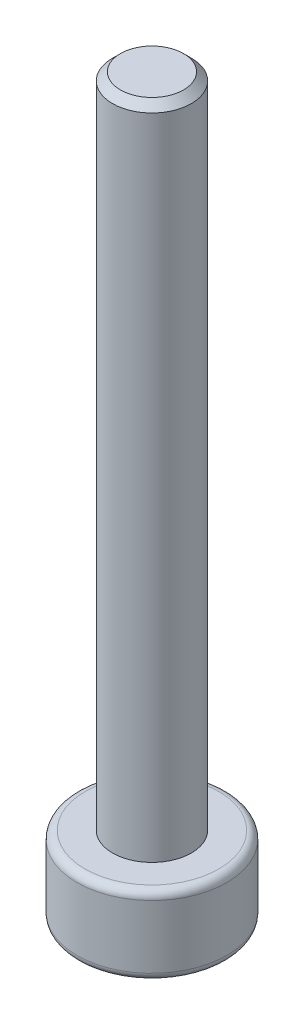
ISO-10303-21;
HEADER;
FILE_DESCRIPTION(('STEP AP214'),'2;1');
FILE_NAME('part.step','',(''),(''),'','','');
FILE_SCHEMA(('AUTOMOTIVE_DESIGN { 1 0 10303 214 1 1 1 1 }'));
ENDSEC;
DATA;
#1=APPLICATION_CONTEXT('core data for automotive mechanical design processes');
#2=APPLICATION_PROTOCOL_DEFINITION('international standard','automotive_design',2000,#1);
#3=PRODUCT_CONTEXT('',#1,'mechanical');
#4=PRODUCT('Part','Part','',(#3));
#5=PRODUCT_RELATED_PRODUCT_CATEGORY('part','',(#4));
#6=PRODUCT_DEFINITION_FORMATION('','',#4);
#7=PRODUCT_DEFINITION_CONTEXT('part definition',#1,'design');
#8=PRODUCT_DEFINITION('design','',#6,#7);
#9=PRODUCT_DEFINITION_SHAPE('','',#8);
#10=(LENGTH_UNIT() NAMED_UNIT(*) SI_UNIT(.MILLI.,.METRE.));
#11=(NAMED_UNIT(*) PLANE_ANGLE_UNIT() SI_UNIT($,.RADIAN.));
#12=(NAMED_UNIT(*) SI_UNIT($,.STERADIAN.) SOLID_ANGLE_UNIT());
#13=UNCERTAINTY_MEASURE_WITH_UNIT(LENGTH_MEASURE(1.E-05),#10,'distance_accuracy_value','');
#14=(GEOMETRIC_REPRESENTATION_CONTEXT(3) GLOBAL_UNCERTAINTY_ASSIGNED_CONTEXT((#13)) GLOBAL_UNIT_ASSIGNED_CONTEXT((#10,
#11,#12)) REPRESENTATION_CONTEXT('',''));
#15=CARTESIAN_POINT('',(0.,0.,0.));
#16=DIRECTION('',(0.,0.,1.));
#17=DIRECTION('',(1.,0.,0.));
#18=AXIS2_PLACEMENT_3D('',#15,#16,#17);
#19=CARTESIAN_POINT('',(0.,3.,0.));
#20=DIRECTION('',(0.,-1.,0.));
#21=DIRECTION('',(0.,0.,-1.));
#22=AXIS2_PLACEMENT_3D('',#19,#20,#21);
#23=CYLINDRICAL_SURFACE('',#22,2.85);
#24=CARTESIAN_POINT('',(0.,2.7,0.));
#25=DIRECTION('',(0.,1.,0.));
#26=DIRECTION('',(0.,0.,1.));
#27=AXIS2_PLACEMENT_3D('',#24,#25,#26);
#28=CIRCLE('',#27,2.85);
#29=CARTESIAN_POINT('',(0.,2.7,2.85));
#30=VERTEX_POINT('',#29);
#31=EDGE_CURVE('E68',#30,#30,#28,.F.);
#32=ORIENTED_EDGE('',*,*,#31,.T.);
#33=EDGE_LOOP('',(#32));
#34=FACE_BOUND('',#33,.T.);
#35=CARTESIAN_POINT('',(0.,0.3,0.));
#36=DIRECTION('',(0.,1.,0.));
#37=DIRECTION('',(0.,0.,1.));
#38=AXIS2_PLACEMENT_3D('',#35,#36,#37);
#39=CIRCLE('',#38,2.85);
#40=CARTESIAN_POINT('',(0.,0.3,2.85));
#41=VERTEX_POINT('',#40);
#42=EDGE_CURVE('E72',#41,#41,#39,.T.);
#43=ORIENTED_EDGE('',*,*,#42,.T.);
#44=EDGE_LOOP('',(#43));
#45=FACE_BOUND('',#44,.T.);
#46=ADVANCED_FACE('F39',(#34,#45),#23,.T.);
#47=CARTESIAN_POINT('',(0.,3.,0.));
#48=DIRECTION('',(0.,1.,0.));
#49=DIRECTION('',(0.,0.,1.));
#50=AXIS2_PLACEMENT_3D('',#47,#48,#49);
#51=PLANE('',#50);
#52=CARTESIAN_POINT('',(0.,3.,0.));
#53=DIRECTION('',(0.,1.,0.));
#54=DIRECTION('',(0.,0.,1.));
#55=AXIS2_PLACEMENT_3D('',#52,#53,#54);
#56=CIRCLE('',#55,2.55);
#57=CARTESIAN_POINT('',(0.,3.,2.55));
#58=VERTEX_POINT('',#57);
#59=EDGE_CURVE('E76',#58,#58,#56,.T.);
#60=ORIENTED_EDGE('',*,*,#59,.T.);
#61=EDGE_LOOP('',(#60));
#62=FACE_BOUND('',#61,.T.);
#63=CARTESIAN_POINT('',(0.,3.,0.));
#64=DIRECTION('',(0.,1.,0.));
#65=DIRECTION('',(0.,0.,1.));
#66=AXIS2_PLACEMENT_3D('',#63,#64,#65);
#67=CIRCLE('',#66,1.5);
#68=CARTESIAN_POINT('',(0.,3.,1.5));
#69=VERTEX_POINT('',#68);
#70=EDGE_CURVE('E80',#69,#69,#67,.T.);
#71=ORIENTED_EDGE('',*,*,#70,.F.);
#72=EDGE_LOOP('',(#71));
#73=FACE_BOUND('',#72,.T.);
#74=ADVANCED_FACE('F105',(#62,#73),#51,.T.);
#75=CARTESIAN_POINT('',(0.,0.,0.));
#76=DIRECTION('',(0.,1.,0.));
#77=DIRECTION('',(0.,0.,1.));
#78=AXIS2_PLACEMENT_3D('',#75,#76,#77);
#79=PLANE('',#78);
#80=CARTESIAN_POINT('',(0.,0.,0.));
#81=DIRECTION('',(0.,1.,0.));
#82=DIRECTION('',(0.,0.,1.));
#83=AXIS2_PLACEMENT_3D('',#80,#81,#82);
#84=CIRCLE('',#83,1.44);
#85=CARTESIAN_POINT('',(0.,0.,1.44));
#86=VERTEX_POINT('',#85);
#87=EDGE_CURVE('E10',#86,#86,#84,.T.);
#88=ORIENTED_EDGE('',*,*,#87,.T.);
#89=EDGE_LOOP('',(#88));
#90=FACE_BOUND('',#89,.T.);
#91=CARTESIAN_POINT('',(0.,0.,0.));
#92=DIRECTION('',(0.,1.,0.));
#93=DIRECTION('',(0.,0.,1.));
#94=AXIS2_PLACEMENT_3D('',#91,#92,#93);
#95=CIRCLE('',#94,2.55);
#96=CARTESIAN_POINT('',(0.,0.,2.55));
#97=VERTEX_POINT('',#96);
#98=EDGE_CURVE('E64',#97,#97,#95,.F.);
#99=ORIENTED_EDGE('',*,*,#98,.T.);
#100=EDGE_LOOP('',(#99));
#101=FACE_BOUND('',#100,.T.);
#102=ADVANCED_FACE('F111',(#90,#101),#79,.F.);
#103=CARTESIAN_POINT('',(0.,28.,0.));
#104=DIRECTION('',(0.,-1.,0.));
#105=DIRECTION('',(0.,0.,-1.));
#106=AXIS2_PLACEMENT_3D('',#103,#104,#105);
#107=CYLINDRICAL_SURFACE('',#106,1.5);
#108=CARTESIAN_POINT('',(0.,27.7,0.));
#109=DIRECTION('',(0.,1.,0.));
#110=DIRECTION('',(0.,0.,1.));
#111=AXIS2_PLACEMENT_3D('',#108,#109,#110);
#112=CIRCLE('',#111,1.5);
#113=CARTESIAN_POINT('',(0.,27.7,1.5));
#114=VERTEX_POINT('',#113);
#115=EDGE_CURVE('E53',#114,#114,#112,.F.);
#116=ORIENTED_EDGE('',*,*,#115,.T.);
#117=EDGE_LOOP('',(#116));
#118=FACE_BOUND('',#117,.T.);
#119=ORIENTED_EDGE('',*,*,#70,.T.);
#120=EDGE_LOOP('',(#119));
#121=FACE_BOUND('',#120,.T.);
#122=ADVANCED_FACE('F101',(#118,#121),#107,.T.);
#123=CARTESIAN_POINT('',(0.,28.,0.));
#124=DIRECTION('',(0.,1.,0.));
#125=DIRECTION('',(0.,0.,1.));
#126=AXIS2_PLACEMENT_3D('',#123,#124,#125);
#127=PLANE('',#126);
#128=CARTESIAN_POINT('',(0.,28.,0.));
#129=DIRECTION('',(0.,1.,0.));
#130=DIRECTION('',(0.,0.,1.));
#131=AXIS2_PLACEMENT_3D('',#128,#129,#130);
#132=CIRCLE('',#131,1.2);
#133=CARTESIAN_POINT('',(0.,28.,1.2));
#134=VERTEX_POINT('',#133);
#135=EDGE_CURVE('E58',#134,#134,#132,.T.);
#136=ORIENTED_EDGE('',*,*,#135,.T.);
#137=EDGE_LOOP('',(#136));
#138=FACE_BOUND('',#137,.T.);
#139=ADVANCED_FACE('F93',(#138),#127,.T.);
#140=CARTESIAN_POINT('',(0.,1.3,0.));
#141=DIRECTION('',(0.,-1.,0.));
#142=DIRECTION('',(0.,0.,-1.));
#143=AXIS2_PLACEMENT_3D('',#140,#141,#142);
#144=CYLINDRICAL_SURFACE('',#143,1.29);
#145=CARTESIAN_POINT('',(0.,0.150000000000001,0.));
#146=DIRECTION('',(0.,1.,0.));
#147=DIRECTION('',(0.,0.,1.));
#148=AXIS2_PLACEMENT_3D('',#145,#146,#147);
#149=CIRCLE('',#148,1.29);
#150=CARTESIAN_POINT('',(0.,0.150000000000001,1.29));
#151=VERTEX_POINT('',#150);
#152=EDGE_CURVE('E48',#151,#151,#149,.F.);
#153=ORIENTED_EDGE('',*,*,#152,.T.);
#154=EDGE_LOOP('',(#153));
#155=FACE_BOUND('',#154,.T.);
#156=CARTESIAN_POINT('',(0.,1.3,0.));
#157=DIRECTION('',(0.,-1.,0.));
#158=DIRECTION('',(0.,0.,-1.));
#159=AXIS2_PLACEMENT_3D('',#156,#157,#158);
#160=CIRCLE('',#159,1.29);
#161=CARTESIAN_POINT('',(0.,1.3,-1.29));
#162=VERTEX_POINT('',#161);
#163=EDGE_CURVE('E84',#162,#162,#160,.T.);
#164=ORIENTED_EDGE('',*,*,#163,.F.);
#165=EDGE_LOOP('',(#164));
#166=FACE_BOUND('',#165,.T.);
#167=ADVANCED_FACE('F91',(#155,#166),#144,.F.);
#168=CARTESIAN_POINT('',(0.,1.3,0.));
#169=DIRECTION('',(0.,-1.,0.));
#170=DIRECTION('',(0.,0.,-1.));
#171=AXIS2_PLACEMENT_3D('',#168,#169,#170);
#172=PLANE('',#171);
#173=ORIENTED_EDGE('',*,*,#163,.T.);
#174=EDGE_LOOP('',(#173));
#175=FACE_BOUND('',#174,.T.);
#176=ADVANCED_FACE('F89',(#175),#172,.T.);
#177=CARTESIAN_POINT('',(0.,2.7,0.));
#178=DIRECTION('',(0.,1.,0.));
#179=DIRECTION('',(0.,0.,1.));
#180=AXIS2_PLACEMENT_3D('',#177,#178,#179);
#181=TOROIDAL_SURFACE('',#180,2.55,0.3);
#182=ORIENTED_EDGE('',*,*,#31,.F.);
#183=EDGE_LOOP('',(#182));
#184=FACE_BOUND('',#183,.T.);
#185=ORIENTED_EDGE('',*,*,#59,.F.);
#186=EDGE_LOOP('',(#185));
#187=FACE_BOUND('',#186,.T.);
#188=ADVANCED_FACE('F99',(#184,#187),#181,.T.);
#189=CARTESIAN_POINT('',(0.,0.3,0.));
#190=DIRECTION('',(0.,1.,0.));
#191=DIRECTION('',(0.,0.,1.));
#192=AXIS2_PLACEMENT_3D('',#189,#190,#191);
#193=TOROIDAL_SURFACE('',#192,2.55,0.3);
#194=ORIENTED_EDGE('',*,*,#98,.F.);
#195=EDGE_LOOP('',(#194));
#196=FACE_BOUND('',#195,.T.);
#197=ORIENTED_EDGE('',*,*,#42,.F.);
#198=EDGE_LOOP('',(#197));
#199=FACE_BOUND('',#198,.T.);
#200=ADVANCED_FACE('F119',(#196,#199),#193,.T.);
#201=CARTESIAN_POINT('',(0.,28.,0.));
#202=DIRECTION('',(0.,-1.,0.));
#203=DIRECTION('',(0.,0.,-1.));
#204=AXIS2_PLACEMENT_3D('',#201,#202,#203);
#205=CONICAL_SURFACE('',#204,1.2,0.785398163397447);
#206=ORIENTED_EDGE('',*,*,#115,.F.);
#207=EDGE_LOOP('',(#206));
#208=FACE_BOUND('',#207,.T.);
#209=ORIENTED_EDGE('',*,*,#135,.F.);
#210=EDGE_LOOP('',(#209));
#211=FACE_BOUND('',#210,.T.);
#212=ADVANCED_FACE('F122',(#208,#211),#205,.T.);
#213=CARTESIAN_POINT('',(0.,0.150000000000001,0.));
#214=DIRECTION('',(0.,-1.,0.));
#215=DIRECTION('',(0.,0.,-1.));
#216=AXIS2_PLACEMENT_3D('',#213,#214,#215);
#217=CONICAL_SURFACE('',#216,1.29,0.785398163397456);
#218=ORIENTED_EDGE('',*,*,#87,.F.);
#219=EDGE_LOOP('',(#218));
#220=FACE_BOUND('',#219,.T.);
#221=ORIENTED_EDGE('',*,*,#152,.F.);
#222=EDGE_LOOP('',(#221));
#223=FACE_BOUND('',#222,.T.);
#224=ADVANCED_FACE('F42',(#220,#223),#217,.F.);
#225=CLOSED_SHELL('',(#46,#74,#102,#122,#139,#167,#176,#188,#200,#212,#224));
#226=MANIFOLD_SOLID_BREP('B2',#225);
#227=ADVANCED_BREP_SHAPE_REPRESENTATION('',(#18,#226),#14);
#228=SHAPE_DEFINITION_REPRESENTATION(#9,#227);
ENDSEC;
END-ISO-10303-21;
